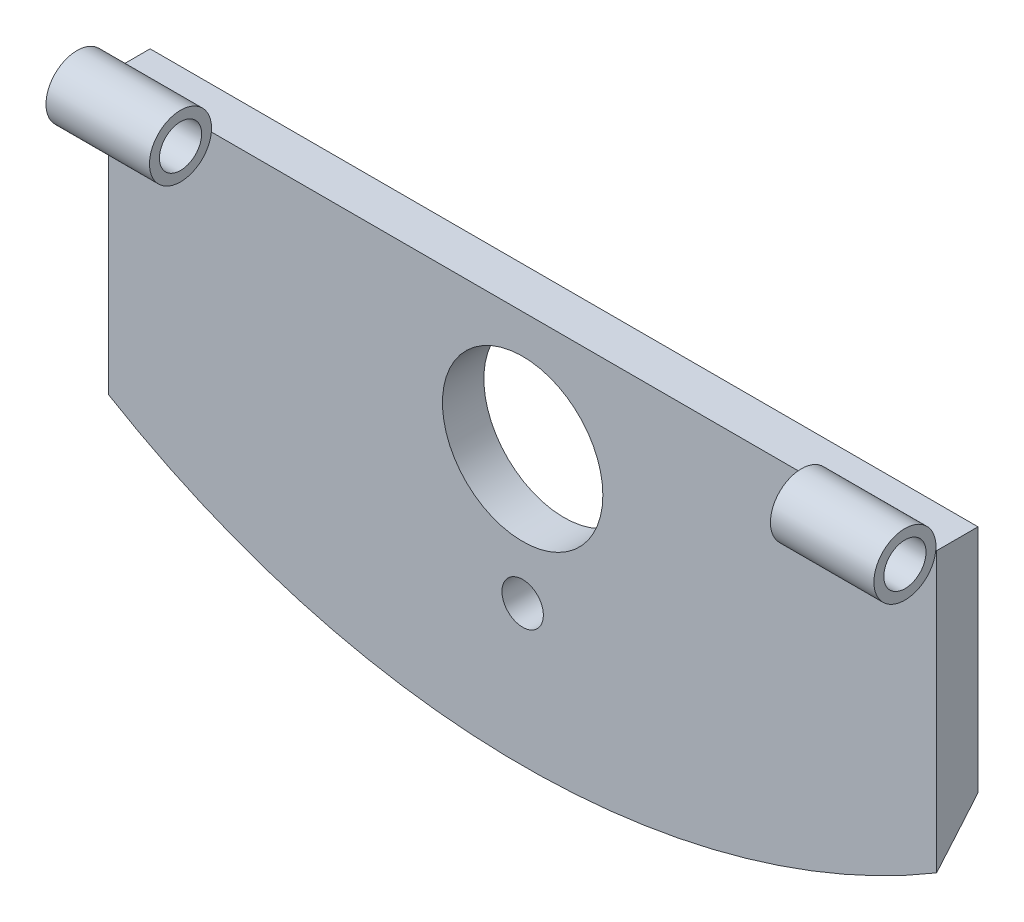
ISO-10303-21;
HEADER;
FILE_DESCRIPTION(('STEP AP214'),'2;1');
FILE_NAME('part.step','',(''),(''),'','','');
FILE_SCHEMA(('AUTOMOTIVE_DESIGN { 1 0 10303 214 1 1 1 1 }'));
ENDSEC;
DATA;
#1=APPLICATION_CONTEXT('core data for automotive mechanical design processes');
#2=APPLICATION_PROTOCOL_DEFINITION('international standard','automotive_design',2000,#1);
#3=PRODUCT_CONTEXT('',#1,'mechanical');
#4=PRODUCT('Part','Part','',(#3));
#5=PRODUCT_RELATED_PRODUCT_CATEGORY('part','',(#4));
#6=PRODUCT_DEFINITION_FORMATION('','',#4);
#7=PRODUCT_DEFINITION_CONTEXT('part definition',#1,'design');
#8=PRODUCT_DEFINITION('design','',#6,#7);
#9=PRODUCT_DEFINITION_SHAPE('','',#8);
#10=(LENGTH_UNIT() NAMED_UNIT(*) SI_UNIT(.MILLI.,.METRE.));
#11=(NAMED_UNIT(*) PLANE_ANGLE_UNIT() SI_UNIT($,.RADIAN.));
#12=(NAMED_UNIT(*) SI_UNIT($,.STERADIAN.) SOLID_ANGLE_UNIT());
#13=UNCERTAINTY_MEASURE_WITH_UNIT(LENGTH_MEASURE(1.E-05),#10,'distance_accuracy_value','');
#14=(GEOMETRIC_REPRESENTATION_CONTEXT(3) GLOBAL_UNCERTAINTY_ASSIGNED_CONTEXT((#13)) GLOBAL_UNIT_ASSIGNED_CONTEXT((#10,
#11,#12)) REPRESENTATION_CONTEXT('',''));
#15=CARTESIAN_POINT('',(0.,0.,0.));
#16=DIRECTION('',(0.,0.,1.));
#17=DIRECTION('',(1.,0.,0.));
#18=AXIS2_PLACEMENT_3D('',#15,#16,#17);
#19=CARTESIAN_POINT('',(60.,0.782069774418923,14.1223869730976));
#20=DIRECTION('',(1.,0.,0.));
#21=DIRECTION('',(0.,0.,-1.));
#22=AXIS2_PLACEMENT_3D('',#19,#20,#21);
#23=CYLINDRICAL_SURFACE('',#22,6.00000000000001);
#24=CARTESIAN_POINT('',(60.,0.782069774418923,14.1223869730976));
#25=DIRECTION('',(1.,0.,0.));
#26=DIRECTION('',(0.,0.,-1.));
#27=AXIS2_PLACEMENT_3D('',#24,#25,#26);
#28=CIRCLE('',#27,6.00000000000001);
#29=CARTESIAN_POINT('',(60.,0.782069774418923,8.12238697309758));
#30=VERTEX_POINT('',#29);
#31=EDGE_CURVE('E11',#30,#30,#28,.T.);
#32=ORIENTED_EDGE('',*,*,#31,.T.);
#33=EDGE_LOOP('',(#32));
#34=FACE_BOUND('',#33,.T.);
#35=CARTESIAN_POINT('',(80.,0.782069774418923,14.1223869730976));
#36=DIRECTION('',(1.,0.,0.));
#37=DIRECTION('',(0.,0.,-1.));
#38=AXIS2_PLACEMENT_3D('',#35,#36,#37);
#39=CIRCLE('',#38,6.00000000000001);
#40=CARTESIAN_POINT('',(80.,0.782069774418923,8.12238697309758));
#41=VERTEX_POINT('',#40);
#42=EDGE_CURVE('E43',#41,#41,#39,.T.);
#43=ORIENTED_EDGE('',*,*,#42,.F.);
#44=EDGE_LOOP('',(#43));
#45=FACE_BOUND('',#44,.T.);
#46=ADVANCED_FACE('F40',(#34,#45),#23,.T.);
#47=CARTESIAN_POINT('',(60.,0.782069774418923,14.1223869730976));
#48=DIRECTION('',(1.,0.,0.));
#49=DIRECTION('',(0.,0.,-1.));
#50=AXIS2_PLACEMENT_3D('',#47,#48,#49);
#51=PLANE('',#50);
#52=CARTESIAN_POINT('',(60.,0.782069774418923,14.1223869730976));
#53=DIRECTION('',(1.,0.,0.));
#54=DIRECTION('',(0.,0.,-1.));
#55=AXIS2_PLACEMENT_3D('',#52,#53,#54);
#56=CIRCLE('',#55,4.07996408059991);
#57=CARTESIAN_POINT('',(60.,0.782069774418923,10.0424228924977));
#58=VERTEX_POINT('',#57);
#59=EDGE_CURVE('E50',#58,#58,#56,.T.);
#60=ORIENTED_EDGE('',*,*,#59,.T.);
#61=EDGE_LOOP('',(#60));
#62=FACE_BOUND('',#61,.T.);
#63=ORIENTED_EDGE('',*,*,#31,.F.);
#64=EDGE_LOOP('',(#63));
#65=FACE_BOUND('',#64,.T.);
#66=ADVANCED_FACE('F58',(#62,#65),#51,.F.);
#67=CARTESIAN_POINT('',(80.,0.782069774418923,14.1223869730976));
#68=DIRECTION('',(1.,0.,0.));
#69=DIRECTION('',(0.,0.,-1.));
#70=AXIS2_PLACEMENT_3D('',#67,#68,#69);
#71=PLANE('',#70);
#72=CARTESIAN_POINT('',(80.,0.782069774418923,14.1223869730976));
#73=DIRECTION('',(1.,0.,0.));
#74=DIRECTION('',(0.,0.,-1.));
#75=AXIS2_PLACEMENT_3D('',#72,#73,#74);
#76=CIRCLE('',#75,4.07996408059991);
#77=CARTESIAN_POINT('',(80.,0.782069774418923,10.0424228924977));
#78=VERTEX_POINT('',#77);
#79=EDGE_CURVE('E52',#78,#78,#76,.T.);
#80=ORIENTED_EDGE('',*,*,#79,.F.);
#81=EDGE_LOOP('',(#80));
#82=FACE_BOUND('',#81,.T.);
#83=ORIENTED_EDGE('',*,*,#42,.T.);
#84=EDGE_LOOP('',(#83));
#85=FACE_BOUND('',#84,.T.);
#86=ADVANCED_FACE('F64',(#82,#85),#71,.T.);
#87=CARTESIAN_POINT('',(60.,0.782069774418923,14.1223869730976));
#88=DIRECTION('',(1.,0.,0.));
#89=DIRECTION('',(0.,0.,-1.));
#90=AXIS2_PLACEMENT_3D('',#87,#88,#89);
#91=CYLINDRICAL_SURFACE('',#90,4.07996408059991);
#92=ORIENTED_EDGE('',*,*,#59,.F.);
#93=EDGE_LOOP('',(#92));
#94=FACE_BOUND('',#93,.T.);
#95=ORIENTED_EDGE('',*,*,#79,.T.);
#96=EDGE_LOOP('',(#95));
#97=FACE_BOUND('',#96,.T.);
#98=ADVANCED_FACE('F61',(#94,#97),#91,.F.);
#99=CLOSED_SHELL('',(#46,#66,#86,#98));
#100=MANIFOLD_SOLID_BREP('B2',#99);
#101=CARTESIAN_POINT('',(-60.,0.782069774418923,14.1223869730976));
#102=DIRECTION('',(-1.,0.,0.));
#103=DIRECTION('',(0.,-1.,0.));
#104=AXIS2_PLACEMENT_3D('',#101,#102,#103);
#105=CYLINDRICAL_SURFACE('',#104,6.00000000000001);
#106=CARTESIAN_POINT('',(-60.,0.782069774418923,14.1223869730976));
#107=DIRECTION('',(-1.,0.,0.));
#108=DIRECTION('',(0.,-1.,0.));
#109=AXIS2_PLACEMENT_3D('',#106,#107,#108);
#110=CIRCLE('',#109,6.00000000000001);
#111=CARTESIAN_POINT('',(-60.,-5.21793022558109,14.1223869730976));
#112=VERTEX_POINT('',#111);
#113=EDGE_CURVE('E39',#112,#112,#110,.T.);
#114=ORIENTED_EDGE('',*,*,#113,.T.);
#115=EDGE_LOOP('',(#114));
#116=FACE_BOUND('',#115,.T.);
#117=CARTESIAN_POINT('',(-80.,0.782069774418917,14.1223869730976));
#118=DIRECTION('',(-1.,0.,0.));
#119=DIRECTION('',(0.,-1.,0.));
#120=AXIS2_PLACEMENT_3D('',#117,#118,#119);
#121=CIRCLE('',#120,6.00000000000001);
#122=CARTESIAN_POINT('',(-80.,-5.2179302255811,14.1223869730976));
#123=VERTEX_POINT('',#122);
#124=EDGE_CURVE('E114',#123,#123,#121,.T.);
#125=ORIENTED_EDGE('',*,*,#124,.F.);
#126=EDGE_LOOP('',(#125));
#127=FACE_BOUND('',#126,.T.);
#128=ADVANCED_FACE('F111',(#116,#127),#105,.T.);
#129=CARTESIAN_POINT('',(-60.,0.782069774418923,14.1223869730976));
#130=DIRECTION('',(-1.,0.,0.));
#131=DIRECTION('',(0.,-1.,0.));
#132=AXIS2_PLACEMENT_3D('',#129,#130,#131);
#133=PLANE('',#132);
#134=CARTESIAN_POINT('',(-60.,0.782069774418923,14.1223869730976));
#135=DIRECTION('',(-1.,0.,0.));
#136=DIRECTION('',(0.,-1.,0.));
#137=AXIS2_PLACEMENT_3D('',#134,#135,#136);
#138=CIRCLE('',#137,4.07996408059991);
#139=CARTESIAN_POINT('',(-60.,-3.29789430618099,14.1223869730976));
#140=VERTEX_POINT('',#139);
#141=EDGE_CURVE('E121',#140,#140,#138,.T.);
#142=ORIENTED_EDGE('',*,*,#141,.T.);
#143=EDGE_LOOP('',(#142));
#144=FACE_BOUND('',#143,.T.);
#145=ORIENTED_EDGE('',*,*,#113,.F.);
#146=EDGE_LOOP('',(#145));
#147=FACE_BOUND('',#146,.T.);
#148=ADVANCED_FACE('F129',(#144,#147),#133,.F.);
#149=CARTESIAN_POINT('',(-80.,0.782069774418917,14.1223869730976));
#150=DIRECTION('',(-1.,0.,0.));
#151=DIRECTION('',(0.,-1.,0.));
#152=AXIS2_PLACEMENT_3D('',#149,#150,#151);
#153=PLANE('',#152);
#154=CARTESIAN_POINT('',(-80.,0.782069774418917,14.1223869730976));
#155=DIRECTION('',(-1.,0.,0.));
#156=DIRECTION('',(0.,-1.,0.));
#157=AXIS2_PLACEMENT_3D('',#154,#155,#156);
#158=CIRCLE('',#157,4.07996408059991);
#159=CARTESIAN_POINT('',(-80.,-3.29789430618099,14.1223869730976));
#160=VERTEX_POINT('',#159);
#161=EDGE_CURVE('E123',#160,#160,#158,.T.);
#162=ORIENTED_EDGE('',*,*,#161,.F.);
#163=EDGE_LOOP('',(#162));
#164=FACE_BOUND('',#163,.T.);
#165=ORIENTED_EDGE('',*,*,#124,.T.);
#166=EDGE_LOOP('',(#165));
#167=FACE_BOUND('',#166,.T.);
#168=ADVANCED_FACE('F135',(#164,#167),#153,.T.);
#169=CARTESIAN_POINT('',(-60.,0.782069774418923,14.1223869730976));
#170=DIRECTION('',(-1.,0.,0.));
#171=DIRECTION('',(0.,-1.,0.));
#172=AXIS2_PLACEMENT_3D('',#169,#170,#171);
#173=CYLINDRICAL_SURFACE('',#172,4.07996408059991);
#174=ORIENTED_EDGE('',*,*,#141,.F.);
#175=EDGE_LOOP('',(#174));
#176=FACE_BOUND('',#175,.T.);
#177=ORIENTED_EDGE('',*,*,#161,.T.);
#178=EDGE_LOOP('',(#177));
#179=FACE_BOUND('',#178,.T.);
#180=ADVANCED_FACE('F132',(#176,#179),#173,.F.);
#181=CLOSED_SHELL('',(#128,#148,#168,#180));
#182=MANIFOLD_SOLID_BREP('B6',#181);
#183=CARTESIAN_POINT('',(-80.,0.,8.));
#184=DIRECTION('',(0.,-1.,0.));
#185=DIRECTION('',(0.,0.,-1.));
#186=AXIS2_PLACEMENT_3D('',#183,#184,#185);
#187=PLANE('',#186);
#188=DIRECTION('',(-1.,0.,0.));
#189=VECTOR('',#188,1.);
#190=CARTESIAN_POINT('',(-80.,0.,0.));
#191=LINE('',#190,#189);
#192=CARTESIAN_POINT('',(80.,0.,0.));
#193=VERTEX_POINT('',#192);
#194=CARTESIAN_POINT('',(-80.,0.,0.));
#195=VERTEX_POINT('',#194);
#196=EDGE_CURVE('E236',#193,#195,#191,.T.);
#197=ORIENTED_EDGE('',*,*,#196,.T.);
#198=DIRECTION('',(0.,0.,-1.));
#199=VECTOR('',#198,1.);
#200=CARTESIAN_POINT('',(-80.,0.,8.));
#201=LINE('',#200,#199);
#202=CARTESIAN_POINT('',(-80.,0.,8.));
#203=VERTEX_POINT('',#202);
#204=EDGE_CURVE('E218',#203,#195,#201,.T.);
#205=ORIENTED_EDGE('',*,*,#204,.F.);
#206=DIRECTION('',(-1.,0.,0.));
#207=VECTOR('',#206,1.);
#208=CARTESIAN_POINT('',(-80.,0.,8.));
#209=LINE('',#208,#207);
#210=CARTESIAN_POINT('',(80.,0.,8.));
#211=VERTEX_POINT('',#210);
#212=EDGE_CURVE('E225',#211,#203,#209,.T.);
#213=ORIENTED_EDGE('',*,*,#212,.F.);
#214=DIRECTION('',(0.,0.,-1.));
#215=VECTOR('',#214,1.);
#216=CARTESIAN_POINT('',(80.,0.,8.));
#217=LINE('',#216,#215);
#218=EDGE_CURVE('E237',#211,#193,#217,.T.);
#219=ORIENTED_EDGE('',*,*,#218,.T.);
#220=EDGE_LOOP('',(#197,#205,#213,#219));
#221=FACE_BOUND('',#220,.T.);
#222=ADVANCED_FACE('F173',(#221),#187,.F.);
#223=CARTESIAN_POINT('',(-80.,0.,8.));
#224=DIRECTION('',(1.,0.,0.));
#225=DIRECTION('',(0.,1.,0.));
#226=AXIS2_PLACEMENT_3D('',#223,#224,#225);
#227=PLANE('',#226);
#228=DIRECTION('',(0.,-1.,0.));
#229=VECTOR('',#228,1.);
#230=CARTESIAN_POINT('',(-80.,0.,0.));
#231=LINE('',#230,#229);
#232=CARTESIAN_POINT('',(-79.9999999999999,-44.515059330187,0.));
#233=VERTEX_POINT('',#232);
#234=EDGE_CURVE('E339',#195,#233,#231,.T.);
#235=ORIENTED_EDGE('',*,*,#234,.T.);
#236=CARTESIAN_POINT('',(-79.9999999999999,-44.515059330187,0.));
#237=CARTESIAN_POINT('',(-79.9999999999999,-45.3026713917592,0.662633860293713));
#238=CARTESIAN_POINT('',(-79.9999999999999,-46.0893798905997,1.32634117210431));
#239=CARTESIAN_POINT('',(-79.9999999999999,-47.6610590728918,2.6558004199428));
#240=CARTESIAN_POINT('',(-79.9999999999999,-48.4460297671014,3.32155234325218));
#241=CARTESIAN_POINT('',(-79.9999999999999,-50.0143120596536,4.65500645232846));
#242=CARTESIAN_POINT('',(-79.9999999999999,-50.797623658774,5.32270863718086));
#243=CARTESIAN_POINT('',(-79.9999999999999,-52.3626613095828,6.65997851359776));
#244=CARTESIAN_POINT('',(-79.9999999999999,-53.1443873513984,7.32954621671702));
#245=CARTESIAN_POINT('',(-79.9999999999999,-53.9253523422656,7.99999999999996));
#246=B_SPLINE_CURVE_WITH_KNOTS('',3,(#236,#237,#238,#239,#240,#241,#242,#243,#244,#245),
.UNSPECIFIED.,.F.,.F.,(4,2,2,2,4),(0.,3.08783720201881,6.17565523488227,9.26347182007583,
12.3513075734816),.UNSPECIFIED.);
#247=CARTESIAN_POINT('',(-79.9999999999999,-53.9253523422656,8.));
#248=VERTEX_POINT('',#247);
#249=EDGE_CURVE('E109',#233,#248,#246,.T.);
#250=ORIENTED_EDGE('',*,*,#249,.T.);
#251=DIRECTION('',(0.,-1.,0.));
#252=VECTOR('',#251,1.);
#253=CARTESIAN_POINT('',(-80.,0.,8.));
#254=LINE('',#253,#252);
#255=EDGE_CURVE('E214',#203,#248,#254,.T.);
#256=ORIENTED_EDGE('',*,*,#255,.F.);
#257=ORIENTED_EDGE('',*,*,#204,.T.);
#258=EDGE_LOOP('',(#235,#250,#256,#257));
#259=FACE_BOUND('',#258,.T.);
#260=ADVANCED_FACE('F216',(#259),#227,.F.);
#261=CARTESIAN_POINT('',(80.,0.,8.));
#262=DIRECTION('',(-1.,0.,0.));
#263=DIRECTION('',(0.,-1.,0.));
#264=AXIS2_PLACEMENT_3D('',#261,#262,#263);
#265=PLANE('',#264);
#266=DIRECTION('',(0.,1.,0.));
#267=VECTOR('',#266,1.);
#268=CARTESIAN_POINT('',(80.,0.,8.));
#269=LINE('',#268,#267);
#270=CARTESIAN_POINT('',(79.9999999999999,-53.9253523422656,8.));
#271=VERTEX_POINT('',#270);
#272=EDGE_CURVE('E229',#271,#211,#269,.T.);
#273=ORIENTED_EDGE('',*,*,#272,.F.);
#274=CARTESIAN_POINT('',(79.9999999999999,-53.9253523422656,7.99999999999998));
#275=CARTESIAN_POINT('',(79.9999999999999,-53.1443873513984,7.32954621671704));
#276=CARTESIAN_POINT('',(79.9999999999999,-52.3626613095828,6.65997851359778));
#277=CARTESIAN_POINT('',(79.9999999999999,-50.797623658774,5.32270863718087));
#278=CARTESIAN_POINT('',(79.9999999999999,-50.0143120596537,4.65500645232847));
#279=CARTESIAN_POINT('',(79.9999999999999,-48.4460297671014,3.32155234325219));
#280=CARTESIAN_POINT('',(79.9999999999999,-47.6610590728918,2.65580041994281));
#281=CARTESIAN_POINT('',(79.9999999999999,-46.0893798905997,1.32634117210432));
#282=CARTESIAN_POINT('',(79.9999999999999,-45.3026713917592,0.662633860293731));
#283=CARTESIAN_POINT('',(79.9999999999999,-44.515059330187,0.));
#284=B_SPLINE_CURVE_WITH_KNOTS('',3,(#274,#275,#276,#277,#278,#279,#280,#281,#282,#283),
.UNSPECIFIED.,.F.,.F.,(4,2,2,2,4),(0.,3.08783575340576,6.17565233859933,9.2634703714628,
12.3513075734816),.UNSPECIFIED.);
#285=CARTESIAN_POINT('',(79.9999999999999,-44.515059330187,0.));
#286=VERTEX_POINT('',#285);
#287=EDGE_CURVE('E197',#271,#286,#284,.T.);
#288=ORIENTED_EDGE('',*,*,#287,.T.);
#289=DIRECTION('',(0.,1.,0.));
#290=VECTOR('',#289,1.);
#291=CARTESIAN_POINT('',(80.,0.,0.));
#292=LINE('',#291,#290);
#293=EDGE_CURVE('E233',#286,#193,#292,.T.);
#294=ORIENTED_EDGE('',*,*,#293,.T.);
#295=ORIENTED_EDGE('',*,*,#218,.F.);
#296=EDGE_LOOP('',(#273,#288,#294,#295));
#297=FACE_BOUND('',#296,.T.);
#298=ADVANCED_FACE('F247',(#297),#265,.F.);
#299=CARTESIAN_POINT('',(0.,80.,8.));
#300=DIRECTION('',(0.,0.,1.));
#301=DIRECTION('',(1.,0.,0.));
#302=AXIS2_PLACEMENT_3D('',#299,#300,#301);
#303=PLANE('',#302);
#304=CARTESIAN_POINT('',(0.,-48.8065942879695,8.));
#305=DIRECTION('',(0.,0.,1.));
#306=DIRECTION('',(1.,0.,0.));
#307=AXIS2_PLACEMENT_3D('',#304,#305,#306);
#308=CIRCLE('',#307,4.);
#309=CARTESIAN_POINT('',(4.,-48.8065942879695,8.));
#310=VERTEX_POINT('',#309);
#311=EDGE_CURVE('E325',#310,#310,#308,.T.);
#312=ORIENTED_EDGE('',*,*,#311,.F.);
#313=EDGE_LOOP('',(#312));
#314=FACE_BOUND('',#313,.T.);
#315=CARTESIAN_POINT('',(0.,-22.9642975327565,8.));
#316=DIRECTION('',(0.,0.,1.));
#317=DIRECTION('',(1.,0.,0.));
#318=AXIS2_PLACEMENT_3D('',#315,#316,#317);
#319=CIRCLE('',#318,15.5);
#320=CARTESIAN_POINT('',(15.5,-22.9642975327565,8.));
#321=VERTEX_POINT('',#320);
#322=EDGE_CURVE('E328',#321,#321,#319,.T.);
#323=ORIENTED_EDGE('',*,*,#322,.F.);
#324=EDGE_LOOP('',(#323));
#325=FACE_BOUND('',#324,.T.);
#326=ORIENTED_EDGE('',*,*,#212,.T.);
#327=ORIENTED_EDGE('',*,*,#255,.T.);
#328=CARTESIAN_POINT('',(0.,80.,8.));
#329=DIRECTION('',(0.,0.,1.));
#330=DIRECTION('',(1.,0.,0.));
#331=AXIS2_PLACEMENT_3D('',#328,#329,#330);
#332=CIRCLE('',#331,156.);
#333=EDGE_CURVE('E224',#248,#271,#332,.T.);
#334=ORIENTED_EDGE('',*,*,#333,.T.);
#335=ORIENTED_EDGE('',*,*,#272,.T.);
#336=EDGE_LOOP('',(#326,#327,#334,#335));
#337=FACE_BOUND('',#336,.T.);
#338=ADVANCED_FACE('F228',(#314,#325,#337),#303,.T.);
#339=CARTESIAN_POINT('',(0.,80.,0.));
#340=DIRECTION('',(0.,0.,1.));
#341=DIRECTION('',(1.,0.,0.));
#342=AXIS2_PLACEMENT_3D('',#339,#340,#341);
#343=PLANE('',#342);
#344=CARTESIAN_POINT('',(0.,-48.8065942879695,0.));
#345=DIRECTION('',(0.,0.,1.));
#346=DIRECTION('',(1.,0.,0.));
#347=AXIS2_PLACEMENT_3D('',#344,#345,#346);
#348=CIRCLE('',#347,4.);
#349=CARTESIAN_POINT('',(4.,-48.8065942879695,0.));
#350=VERTEX_POINT('',#349);
#351=EDGE_CURVE('E178',#350,#350,#348,.T.);
#352=ORIENTED_EDGE('',*,*,#351,.T.);
#353=EDGE_LOOP('',(#352));
#354=FACE_BOUND('',#353,.T.);
#355=CARTESIAN_POINT('',(0.,-22.9642975327565,0.));
#356=DIRECTION('',(0.,0.,1.));
#357=DIRECTION('',(1.,0.,0.));
#358=AXIS2_PLACEMENT_3D('',#355,#356,#357);
#359=CIRCLE('',#358,15.5);
#360=CARTESIAN_POINT('',(15.5,-22.9642975327565,0.));
#361=VERTEX_POINT('',#360);
#362=EDGE_CURVE('E330',#361,#361,#359,.T.);
#363=ORIENTED_EDGE('',*,*,#362,.T.);
#364=EDGE_LOOP('',(#363));
#365=FACE_BOUND('',#364,.T.);
#366=ORIENTED_EDGE('',*,*,#293,.F.);
#367=CARTESIAN_POINT('',(0.,80.,0.));
#368=DIRECTION('',(0.,0.,1.));
#369=DIRECTION('',(1.,0.,0.));
#370=AXIS2_PLACEMENT_3D('',#367,#368,#369);
#371=CIRCLE('',#370,148.);
#372=EDGE_CURVE('E183',#286,#233,#371,.F.);
#373=ORIENTED_EDGE('',*,*,#372,.T.);
#374=ORIENTED_EDGE('',*,*,#234,.F.);
#375=ORIENTED_EDGE('',*,*,#196,.F.);
#376=EDGE_LOOP('',(#366,#373,#374,#375));
#377=FACE_BOUND('',#376,.T.);
#378=ADVANCED_FACE('F252',(#354,#365,#377),#343,.F.);
#379=CARTESIAN_POINT('',(0.,-22.9642975327565,0.));
#380=DIRECTION('',(0.,0.,1.));
#381=DIRECTION('',(1.,0.,0.));
#382=AXIS2_PLACEMENT_3D('',#379,#380,#381);
#383=CYLINDRICAL_SURFACE('',#382,15.5);
#384=ORIENTED_EDGE('',*,*,#362,.F.);
#385=EDGE_LOOP('',(#384));
#386=FACE_BOUND('',#385,.T.);
#387=ORIENTED_EDGE('',*,*,#322,.T.);
#388=EDGE_LOOP('',(#387));
#389=FACE_BOUND('',#388,.T.);
#390=ADVANCED_FACE('F284',(#386,#389),#383,.F.);
#391=CARTESIAN_POINT('',(0.,80.,7.99999999999998));
#392=DIRECTION('',(0.,0.,1.));
#393=DIRECTION('',(1.,0.,0.));
#394=AXIS2_PLACEMENT_3D('',#391,#392,#393);
#395=CONICAL_SURFACE('',#394,156.,0.785398163397448);
#396=ORIENTED_EDGE('',*,*,#249,.F.);
#397=ORIENTED_EDGE('',*,*,#372,.F.);
#398=ORIENTED_EDGE('',*,*,#287,.F.);
#399=ORIENTED_EDGE('',*,*,#333,.F.);
#400=EDGE_LOOP('',(#396,#397,#398,#399));
#401=FACE_BOUND('',#400,.T.);
#402=ADVANCED_FACE('F175',(#401),#395,.T.);
#403=CARTESIAN_POINT('',(0.,-48.8065942879695,-52.));
#404=DIRECTION('',(0.,0.,1.));
#405=DIRECTION('',(1.,0.,0.));
#406=AXIS2_PLACEMENT_3D('',#403,#404,#405);
#407=CYLINDRICAL_SURFACE('',#406,4.);
#408=CARTESIAN_POINT('',(4.,-48.8065942879695,8.));
#409=CARTESIAN_POINT('',(4.,-48.8065942879695,7.91666666666667));
#410=CARTESIAN_POINT('',(4.,-48.8065942879695,7.83333333333333));
#411=CARTESIAN_POINT('',(4.,-48.8065942879695,7.66666666666667));
#412=CARTESIAN_POINT('',(4.,-48.8065942879695,7.58333333333333));
#413=CARTESIAN_POINT('',(4.,-48.8065942879695,7.41666666666667));
#414=CARTESIAN_POINT('',(4.,-48.8065942879695,7.33333333333333));
#415=CARTESIAN_POINT('',(4.,-48.8065942879695,7.16666666666667));
#416=CARTESIAN_POINT('',(4.,-48.8065942879695,7.08333333333333));
#417=CARTESIAN_POINT('',(4.,-48.8065942879695,6.91666666666667));
#418=CARTESIAN_POINT('',(4.,-48.8065942879695,6.83333333333333));
#419=CARTESIAN_POINT('',(4.,-48.8065942879695,6.66666666666667));
#420=CARTESIAN_POINT('',(4.,-48.8065942879695,6.58333333333333));
#421=CARTESIAN_POINT('',(4.,-48.8065942879695,6.41666666666667));
#422=CARTESIAN_POINT('',(4.,-48.8065942879695,6.33333333333333));
#423=CARTESIAN_POINT('',(4.,-48.8065942879695,6.16666666666667));
#424=CARTESIAN_POINT('',(4.,-48.8065942879695,6.08333333333333));
#425=CARTESIAN_POINT('',(4.,-48.8065942879695,5.91666666666666));
#426=CARTESIAN_POINT('',(4.,-48.8065942879695,5.83333333333333));
#427=CARTESIAN_POINT('',(4.,-48.8065942879695,5.66666666666666));
#428=CARTESIAN_POINT('',(4.,-48.8065942879695,5.58333333333333));
#429=CARTESIAN_POINT('',(4.,-48.8065942879695,5.41666666666666));
#430=CARTESIAN_POINT('',(4.,-48.8065942879695,5.33333333333333));
#431=CARTESIAN_POINT('',(4.,-48.8065942879695,5.16666666666666));
#432=CARTESIAN_POINT('',(4.,-48.8065942879695,5.08333333333333));
#433=CARTESIAN_POINT('',(4.,-48.8065942879695,4.91666666666666));
#434=CARTESIAN_POINT('',(4.,-48.8065942879695,4.83333333333333));
#435=CARTESIAN_POINT('',(4.,-48.8065942879695,4.66666666666666));
#436=CARTESIAN_POINT('',(4.,-48.8065942879695,4.58333333333333));
#437=CARTESIAN_POINT('',(4.,-48.8065942879695,4.41666666666666));
#438=CARTESIAN_POINT('',(4.,-48.8065942879695,4.33333333333333));
#439=CARTESIAN_POINT('',(4.,-48.8065942879695,4.16666666666666));
#440=CARTESIAN_POINT('',(4.,-48.8065942879695,4.08333333333333));
#441=CARTESIAN_POINT('',(4.,-48.8065942879695,3.91666666666666));
#442=CARTESIAN_POINT('',(4.,-48.8065942879695,3.83333333333333));
#443=CARTESIAN_POINT('',(4.,-48.8065942879695,3.66666666666666));
#444=CARTESIAN_POINT('',(4.,-48.8065942879695,3.58333333333333));
#445=CARTESIAN_POINT('',(4.,-48.8065942879695,3.41666666666666));
#446=CARTESIAN_POINT('',(4.,-48.8065942879695,3.33333333333333));
#447=CARTESIAN_POINT('',(4.,-48.8065942879695,3.16666666666666));
#448=CARTESIAN_POINT('',(4.,-48.8065942879695,3.08333333333333));
#449=CARTESIAN_POINT('',(4.,-48.8065942879695,2.91666666666666));
#450=CARTESIAN_POINT('',(4.,-48.8065942879695,2.83333333333333));
#451=CARTESIAN_POINT('',(4.,-48.8065942879695,2.66666666666666));
#452=CARTESIAN_POINT('',(4.,-48.8065942879695,2.58333333333333));
#453=CARTESIAN_POINT('',(4.,-48.8065942879695,2.41666666666666));
#454=CARTESIAN_POINT('',(4.,-48.8065942879695,2.33333333333333));
#455=CARTESIAN_POINT('',(4.,-48.8065942879695,2.16666666666666));
#456=CARTESIAN_POINT('',(4.,-48.8065942879695,2.08333333333333));
#457=CARTESIAN_POINT('',(4.,-48.8065942879695,1.91666666666666));
#458=CARTESIAN_POINT('',(4.,-48.8065942879695,1.83333333333333));
#459=CARTESIAN_POINT('',(4.,-48.8065942879695,1.66666666666666));
#460=CARTESIAN_POINT('',(4.,-48.8065942879695,1.58333333333333));
#461=CARTESIAN_POINT('',(4.,-48.8065942879695,1.41666666666666));
#462=CARTESIAN_POINT('',(4.,-48.8065942879695,1.33333333333333));
#463=CARTESIAN_POINT('',(4.,-48.8065942879695,1.16666666666666));
#464=CARTESIAN_POINT('',(4.,-48.8065942879695,1.08333333333333));
#465=CARTESIAN_POINT('',(4.,-48.8065942879695,0.916666666666661));
#466=CARTESIAN_POINT('',(4.,-48.8065942879695,0.833333333333327));
#467=CARTESIAN_POINT('',(4.,-48.8065942879695,0.66666666666666));
#468=CARTESIAN_POINT('',(4.,-48.8065942879695,0.583333333333327));
#469=CARTESIAN_POINT('',(4.,-48.8065942879695,0.41666666666666));
#470=CARTESIAN_POINT('',(4.,-48.8065942879695,0.333333333333327));
#471=CARTESIAN_POINT('',(4.,-48.8065942879695,0.16666666666666));
#472=CARTESIAN_POINT('',(4.,-48.8065942879695,0.0833333333333264));
#473=CARTESIAN_POINT('',(4.,-48.8065942879695,0.));
#474=B_SPLINE_CURVE_WITH_KNOTS('',3,(#408,#409,#410,#411,#412,#413,#414,#415,#416,#417,#418,
#419,#420,#421,#422,#423,#424,#425,#426,#427,#428,#429,#430,#431,#432,#433,#434,#435,#436,#437,
#438,#439,#440,#441,#442,#443,#444,#445,#446,#447,#448,#449,#450,#451,#452,#453,#454,#455,#456,
#457,#458,#459,#460,#461,#462,#463,#464,#465,#466,#467,#468,#469,#470,#471,#472,#473),
.UNSPECIFIED.,.F.,.F.,(4,2,2,2,2,2,2,2,2,2,2,2,2,2,2,2,2,2,2,2,2,2,2,2,2,2,2,2,2,2,2,2,4),(0.,
0.25,0.5,0.750000000000001,1.,1.25,1.5,1.75,2.,2.25,2.5,2.75,3.,3.25,3.5,3.75,4.,4.25,4.5,4.75,
5.,5.25,5.50000000000001,5.75000000000001,6.00000000000001,6.25000000000001,6.50000000000001,
6.75000000000001,7.00000000000001,7.25000000000001,7.50000000000001,7.75000000000001,
8.00000000000001),.UNSPECIFIED.);
#475=EDGE_CURVE('BSEAM297',#310,#350,#474,.T.);
#476=ORIENTED_EDGE('',*,*,#311,.T.);
#477=ORIENTED_EDGE('',*,*,#351,.F.);
#478=ORIENTED_EDGE('',*,*,#475,.T.);
#479=ORIENTED_EDGE('',*,*,#475,.F.);
#480=EDGE_LOOP('',(#476,#478,#477,#479));
#481=FACE_BOUND('',#480,.T.);
#482=ADVANCED_FACE('F297',(#481),#407,.F.);
#483=CLOSED_SHELL('',(#222,#260,#298,#338,#378,#390,#402,#482));
#484=MANIFOLD_SOLID_BREP('B34',#483);
#485=ADVANCED_BREP_SHAPE_REPRESENTATION('',(#18,#100,#182,#484),#14);
#486=SHAPE_DEFINITION_REPRESENTATION(#9,#485);
ENDSEC;
END-ISO-10303-21;
